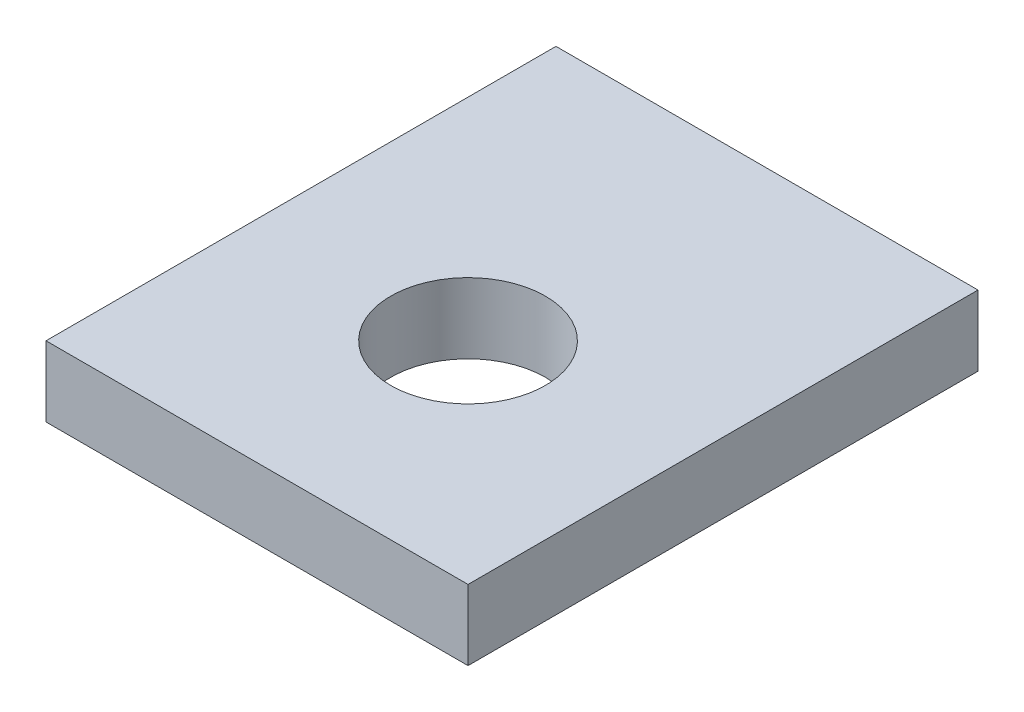
ISO-10303-21;
HEADER;
FILE_DESCRIPTION(('STEP AP214'),'2;1');
FILE_NAME('part.step','',(''),(''),'','','');
FILE_SCHEMA(('AUTOMOTIVE_DESIGN { 1 0 10303 214 1 1 1 1 }'));
ENDSEC;
DATA;
#1=APPLICATION_CONTEXT('core data for automotive mechanical design processes');
#2=APPLICATION_PROTOCOL_DEFINITION('international standard','automotive_design',2000,#1);
#3=PRODUCT_CONTEXT('',#1,'mechanical');
#4=PRODUCT('Part','Part','',(#3));
#5=PRODUCT_RELATED_PRODUCT_CATEGORY('part','',(#4));
#6=PRODUCT_DEFINITION_FORMATION('','',#4);
#7=PRODUCT_DEFINITION_CONTEXT('part definition',#1,'design');
#8=PRODUCT_DEFINITION('design','',#6,#7);
#9=PRODUCT_DEFINITION_SHAPE('','',#8);
#10=(LENGTH_UNIT() NAMED_UNIT(*) SI_UNIT(.MILLI.,.METRE.));
#11=(NAMED_UNIT(*) PLANE_ANGLE_UNIT() SI_UNIT($,.RADIAN.));
#12=(NAMED_UNIT(*) SI_UNIT($,.STERADIAN.) SOLID_ANGLE_UNIT());
#13=UNCERTAINTY_MEASURE_WITH_UNIT(LENGTH_MEASURE(1.E-05),#10,'distance_accuracy_value','');
#14=(GEOMETRIC_REPRESENTATION_CONTEXT(3) GLOBAL_UNCERTAINTY_ASSIGNED_CONTEXT((#13)) GLOBAL_UNIT_ASSIGNED_CONTEXT((#10,
#11,#12)) REPRESENTATION_CONTEXT('',''));
#15=CARTESIAN_POINT('',(0.,0.,0.));
#16=DIRECTION('',(0.,0.,1.));
#17=DIRECTION('',(1.,0.,0.));
#18=AXIS2_PLACEMENT_3D('',#15,#16,#17);
#19=CARTESIAN_POINT('',(0.,-204.2,0.));
#20=DIRECTION('',(0.,-1.,0.));
#21=DIRECTION('',(0.,0.,-1.));
#22=AXIS2_PLACEMENT_3D('',#19,#20,#21);
#23=PLANE('',#22);
#24=DIRECTION('',(0.,0.,1.));
#25=VECTOR('',#24,1.);
#26=CARTESIAN_POINT('',(-16.0091828831705,-204.2,-42.9948828787845));
#27=LINE('',#26,#25);
#28=CARTESIAN_POINT('',(-16.0091828831705,-204.2,-42.9948828787845));
#29=VERTEX_POINT('',#28);
#30=CARTESIAN_POINT('',(-16.0091828831705,-204.2,-35.7448828787845));
#31=VERTEX_POINT('',#30);
#32=EDGE_CURVE('E91',#29,#31,#27,.T.);
#33=ORIENTED_EDGE('',*,*,#32,.T.);
#34=DIRECTION('',(-1.,0.,0.));
#35=VECTOR('',#34,1.);
#36=CARTESIAN_POINT('',(-16.0091828831705,-204.2,-35.7448828787845));
#37=LINE('',#36,#35);
#38=CARTESIAN_POINT('',(-22.0091828831705,-204.2,-35.7448828787845));
#39=VERTEX_POINT('',#38);
#40=EDGE_CURVE('E86',#31,#39,#37,.T.);
#41=ORIENTED_EDGE('',*,*,#40,.T.);
#42=DIRECTION('',(0.,0.,-1.));
#43=VECTOR('',#42,1.);
#44=CARTESIAN_POINT('',(-22.0091828831705,-204.2,-42.9948828787845));
#45=LINE('',#44,#43);
#46=CARTESIAN_POINT('',(-22.0091828831705,-204.2,-42.9948828787845));
#47=VERTEX_POINT('',#46);
#48=EDGE_CURVE('E93',#39,#47,#45,.T.);
#49=ORIENTED_EDGE('',*,*,#48,.T.);
#50=DIRECTION('',(1.,0.,0.));
#51=VECTOR('',#50,1.);
#52=CARTESIAN_POINT('',(-16.0091828831705,-204.2,-42.9948828787845));
#53=LINE('',#52,#51);
#54=EDGE_CURVE('E59',#47,#29,#53,.T.);
#55=ORIENTED_EDGE('',*,*,#54,.T.);
#56=EDGE_LOOP('',(#33,#41,#49,#55));
#57=FACE_BOUND('',#56,.T.);
#58=CARTESIAN_POINT('',(-19.0091828831705,-204.2,-38.7448828787845));
#59=DIRECTION('',(0.,-1.,0.));
#60=DIRECTION('',(0.,0.,-1.));
#61=AXIS2_PLACEMENT_3D('',#58,#59,#60);
#62=CIRCLE('',#61,1.1);
#63=CARTESIAN_POINT('',(-19.0091828831705,-204.2,-39.8448828787845));
#64=VERTEX_POINT('',#63);
#65=EDGE_CURVE('E107',#64,#64,#62,.T.);
#66=ORIENTED_EDGE('',*,*,#65,.F.);
#67=EDGE_LOOP('',(#66));
#68=FACE_BOUND('',#67,.T.);
#69=ADVANCED_FACE('F41',(#57,#68),#23,.T.);
#70=CARTESIAN_POINT('',(0.,-203.2,0.));
#71=DIRECTION('',(0.,-1.,0.));
#72=DIRECTION('',(0.,0.,-1.));
#73=AXIS2_PLACEMENT_3D('',#70,#71,#72);
#74=PLANE('',#73);
#75=DIRECTION('',(0.,0.,1.));
#76=VECTOR('',#75,1.);
#77=CARTESIAN_POINT('',(-16.0091828831705,-203.2,-42.9948828787845));
#78=LINE('',#77,#76);
#79=CARTESIAN_POINT('',(-16.0091828831705,-203.2,-42.9948828787845));
#80=VERTEX_POINT('',#79);
#81=CARTESIAN_POINT('',(-16.0091828831705,-203.2,-35.7448828787845));
#82=VERTEX_POINT('',#81);
#83=EDGE_CURVE('E104',#80,#82,#78,.T.);
#84=ORIENTED_EDGE('',*,*,#83,.F.);
#85=DIRECTION('',(1.,0.,0.));
#86=VECTOR('',#85,1.);
#87=CARTESIAN_POINT('',(-16.0091828831705,-203.2,-42.9948828787845));
#88=LINE('',#87,#86);
#89=CARTESIAN_POINT('',(-22.0091828831705,-203.2,-42.9948828787845));
#90=VERTEX_POINT('',#89);
#91=EDGE_CURVE('E81',#90,#80,#88,.T.);
#92=ORIENTED_EDGE('',*,*,#91,.F.);
#93=DIRECTION('',(0.,0.,-1.));
#94=VECTOR('',#93,1.);
#95=CARTESIAN_POINT('',(-22.0091828831705,-203.2,-42.9948828787845));
#96=LINE('',#95,#94);
#97=CARTESIAN_POINT('',(-22.0091828831705,-203.2,-35.7448828787845));
#98=VERTEX_POINT('',#97);
#99=EDGE_CURVE('E73',#98,#90,#96,.T.);
#100=ORIENTED_EDGE('',*,*,#99,.F.);
#101=DIRECTION('',(-1.,0.,0.));
#102=VECTOR('',#101,1.);
#103=CARTESIAN_POINT('',(-16.0091828831705,-203.2,-35.7448828787845));
#104=LINE('',#103,#102);
#105=EDGE_CURVE('E100',#82,#98,#104,.T.);
#106=ORIENTED_EDGE('',*,*,#105,.F.);
#107=EDGE_LOOP('',(#84,#92,#100,#106));
#108=FACE_BOUND('',#107,.T.);
#109=CARTESIAN_POINT('',(-19.0091828831705,-203.2,-38.7448828787845));
#110=DIRECTION('',(0.,-1.,0.));
#111=DIRECTION('',(0.,0.,-1.));
#112=AXIS2_PLACEMENT_3D('',#109,#110,#111);
#113=CIRCLE('',#112,1.1);
#114=CARTESIAN_POINT('',(-19.0091828831705,-203.2,-39.8448828787845));
#115=VERTEX_POINT('',#114);
#116=EDGE_CURVE('E118',#115,#115,#113,.T.);
#117=ORIENTED_EDGE('',*,*,#116,.T.);
#118=EDGE_LOOP('',(#117));
#119=FACE_BOUND('',#118,.T.);
#120=ADVANCED_FACE('F117',(#108,#119),#74,.F.);
#121=CARTESIAN_POINT('',(-16.0091828831705,-204.2,-42.9948828787845));
#122=DIRECTION('',(-1.,0.,0.));
#123=DIRECTION('',(0.,0.,1.));
#124=AXIS2_PLACEMENT_3D('',#121,#122,#123);
#125=PLANE('',#124);
#126=ORIENTED_EDGE('',*,*,#83,.T.);
#127=DIRECTION('',(0.,1.,0.));
#128=VECTOR('',#127,1.);
#129=CARTESIAN_POINT('',(-16.0091828831705,-204.2,-35.7448828787845));
#130=LINE('',#129,#128);
#131=EDGE_CURVE('E11',#31,#82,#130,.T.);
#132=ORIENTED_EDGE('',*,*,#131,.F.);
#133=ORIENTED_EDGE('',*,*,#32,.F.);
#134=DIRECTION('',(0.,1.,0.));
#135=VECTOR('',#134,1.);
#136=CARTESIAN_POINT('',(-16.0091828831705,-204.2,-42.9948828787845));
#137=LINE('',#136,#135);
#138=EDGE_CURVE('E101',#29,#80,#137,.T.);
#139=ORIENTED_EDGE('',*,*,#138,.T.);
#140=EDGE_LOOP('',(#126,#132,#133,#139));
#141=FACE_BOUND('',#140,.T.);
#142=ADVANCED_FACE('F43',(#141),#125,.F.);
#143=CARTESIAN_POINT('',(-16.0091828831705,-204.2,-35.7448828787845));
#144=DIRECTION('',(0.,0.,-1.));
#145=DIRECTION('',(-1.,0.,0.));
#146=AXIS2_PLACEMENT_3D('',#143,#144,#145);
#147=PLANE('',#146);
#148=ORIENTED_EDGE('',*,*,#105,.T.);
#149=DIRECTION('',(0.,1.,0.));
#150=VECTOR('',#149,1.);
#151=CARTESIAN_POINT('',(-22.0091828831705,-204.2,-35.7448828787845));
#152=LINE('',#151,#150);
#153=EDGE_CURVE('E49',#39,#98,#152,.T.);
#154=ORIENTED_EDGE('',*,*,#153,.F.);
#155=ORIENTED_EDGE('',*,*,#40,.F.);
#156=ORIENTED_EDGE('',*,*,#131,.T.);
#157=EDGE_LOOP('',(#148,#154,#155,#156));
#158=FACE_BOUND('',#157,.T.);
#159=ADVANCED_FACE('F96',(#158),#147,.F.);
#160=CARTESIAN_POINT('',(-22.0091828831705,-204.2,-42.9948828787845));
#161=DIRECTION('',(1.,0.,0.));
#162=DIRECTION('',(0.,0.,-1.));
#163=AXIS2_PLACEMENT_3D('',#160,#161,#162);
#164=PLANE('',#163);
#165=ORIENTED_EDGE('',*,*,#99,.T.);
#166=DIRECTION('',(0.,1.,0.));
#167=VECTOR('',#166,1.);
#168=CARTESIAN_POINT('',(-22.0091828831705,-204.2,-42.9948828787845));
#169=LINE('',#168,#167);
#170=EDGE_CURVE('E98',#47,#90,#169,.T.);
#171=ORIENTED_EDGE('',*,*,#170,.F.);
#172=ORIENTED_EDGE('',*,*,#48,.F.);
#173=ORIENTED_EDGE('',*,*,#153,.T.);
#174=EDGE_LOOP('',(#165,#171,#172,#173));
#175=FACE_BOUND('',#174,.T.);
#176=ADVANCED_FACE('F97',(#175),#164,.F.);
#177=CARTESIAN_POINT('',(-16.0091828831705,-204.2,-42.9948828787845));
#178=DIRECTION('',(0.,0.,1.));
#179=DIRECTION('',(1.,0.,0.));
#180=AXIS2_PLACEMENT_3D('',#177,#178,#179);
#181=PLANE('',#180);
#182=ORIENTED_EDGE('',*,*,#91,.T.);
#183=ORIENTED_EDGE('',*,*,#138,.F.);
#184=ORIENTED_EDGE('',*,*,#54,.F.);
#185=ORIENTED_EDGE('',*,*,#170,.T.);
#186=EDGE_LOOP('',(#182,#183,#184,#185));
#187=FACE_BOUND('',#186,.T.);
#188=ADVANCED_FACE('F114',(#187),#181,.F.);
#189=CARTESIAN_POINT('',(-19.0091828831705,-204.2,-38.7448828787845));
#190=DIRECTION('',(0.,1.,0.));
#191=DIRECTION('',(0.,0.,1.));
#192=AXIS2_PLACEMENT_3D('',#189,#190,#191);
#193=CYLINDRICAL_SURFACE('',#192,1.1);
#194=ORIENTED_EDGE('',*,*,#65,.T.);
#195=EDGE_LOOP('',(#194));
#196=FACE_BOUND('',#195,.T.);
#197=ORIENTED_EDGE('',*,*,#116,.F.);
#198=EDGE_LOOP('',(#197));
#199=FACE_BOUND('',#198,.T.);
#200=ADVANCED_FACE('F127',(#196,#199),#193,.F.);
#201=CLOSED_SHELL('',(#69,#120,#142,#159,#176,#188,#200));
#202=MANIFOLD_SOLID_BREP('B2',#201);
#203=ADVANCED_BREP_SHAPE_REPRESENTATION('',(#18,#202),#14);
#204=SHAPE_DEFINITION_REPRESENTATION(#9,#203);
ENDSEC;
END-ISO-10303-21;
